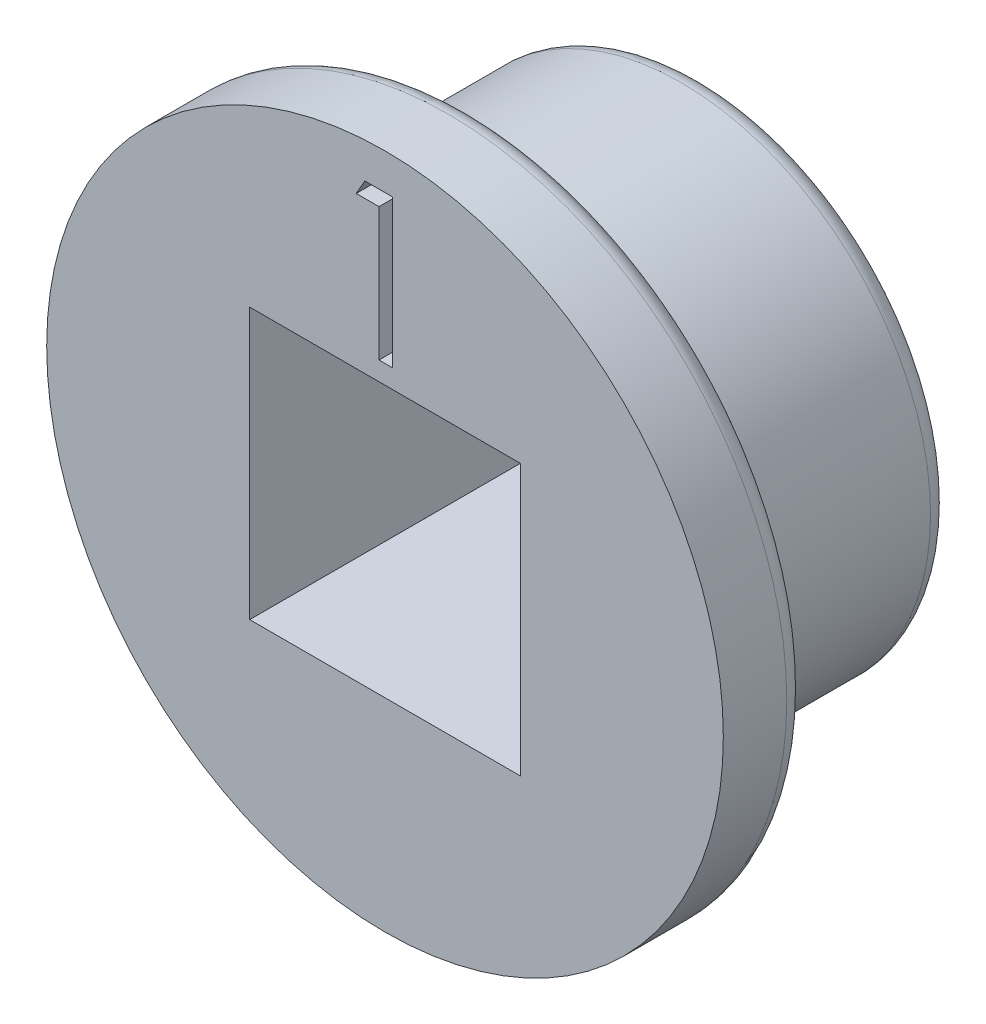
ISO-10303-21;
HEADER;
FILE_DESCRIPTION(('STEP AP214'),'2;1');
FILE_NAME('part.step','',(''),(''),'','','');
FILE_SCHEMA(('AUTOMOTIVE_DESIGN { 1 0 10303 214 1 1 1 1 }'));
ENDSEC;
DATA;
#1=APPLICATION_CONTEXT('core data for automotive mechanical design processes');
#2=APPLICATION_PROTOCOL_DEFINITION('international standard','automotive_design',2000,#1);
#3=PRODUCT_CONTEXT('',#1,'mechanical');
#4=PRODUCT('Part','Part','',(#3));
#5=PRODUCT_RELATED_PRODUCT_CATEGORY('part','',(#4));
#6=PRODUCT_DEFINITION_FORMATION('','',#4);
#7=PRODUCT_DEFINITION_CONTEXT('part definition',#1,'design');
#8=PRODUCT_DEFINITION('design','',#6,#7);
#9=PRODUCT_DEFINITION_SHAPE('','',#8);
#10=(LENGTH_UNIT() NAMED_UNIT(*) SI_UNIT(.MILLI.,.METRE.));
#11=(NAMED_UNIT(*) PLANE_ANGLE_UNIT() SI_UNIT($,.RADIAN.));
#12=(NAMED_UNIT(*) SI_UNIT($,.STERADIAN.) SOLID_ANGLE_UNIT());
#13=UNCERTAINTY_MEASURE_WITH_UNIT(LENGTH_MEASURE(1.E-05),#10,'distance_accuracy_value','');
#14=(GEOMETRIC_REPRESENTATION_CONTEXT(3) GLOBAL_UNCERTAINTY_ASSIGNED_CONTEXT((#13)) GLOBAL_UNIT_ASSIGNED_CONTEXT((#10,
#11,#12)) REPRESENTATION_CONTEXT('',''));
#15=CARTESIAN_POINT('',(0.,0.,0.));
#16=DIRECTION('',(0.,0.,1.));
#17=DIRECTION('',(1.,0.,0.));
#18=AXIS2_PLACEMENT_3D('',#15,#16,#17);
#19=CARTESIAN_POINT('',(0.,0.,2.));
#20=DIRECTION('',(0.,0.,1.));
#21=DIRECTION('',(1.,0.,0.));
#22=AXIS2_PLACEMENT_3D('',#19,#20,#21);
#23=PLANE('',#22);
#24=CARTESIAN_POINT('',(0.,0.,2.));
#25=DIRECTION('',(0.,0.,1.));
#26=DIRECTION('',(1.,0.,0.));
#27=AXIS2_PLACEMENT_3D('',#24,#25,#26);
#28=CIRCLE('',#27,8.);
#29=CARTESIAN_POINT('',(8.,0.,2.));
#30=VERTEX_POINT('',#29);
#31=EDGE_CURVE('E144',#30,#30,#28,.T.);
#32=ORIENTED_EDGE('',*,*,#31,.T.);
#33=EDGE_LOOP('',(#32));
#34=FACE_BOUND('',#33,.T.);
#35=DIRECTION('',(1.,0.,0.));
#36=VECTOR('',#35,1.);
#37=CARTESIAN_POINT('',(0.,3.2,2.));
#38=LINE('',#37,#36);
#39=CARTESIAN_POINT('',(-3.2,3.2,2.));
#40=VERTEX_POINT('',#39);
#41=CARTESIAN_POINT('',(3.2,3.2,2.));
#42=VERTEX_POINT('',#41);
#43=EDGE_CURVE('E150',#40,#42,#38,.T.);
#44=ORIENTED_EDGE('',*,*,#43,.T.);
#45=DIRECTION('',(0.,-1.,0.));
#46=VECTOR('',#45,1.);
#47=CARTESIAN_POINT('',(3.2,0.,2.));
#48=LINE('',#47,#46);
#49=CARTESIAN_POINT('',(3.2,-3.2,2.));
#50=VERTEX_POINT('',#49);
#51=EDGE_CURVE('E159',#42,#50,#48,.T.);
#52=ORIENTED_EDGE('',*,*,#51,.T.);
#53=DIRECTION('',(1.,0.,0.));
#54=VECTOR('',#53,1.);
#55=CARTESIAN_POINT('',(0.,-3.2,2.));
#56=LINE('',#55,#54);
#57=CARTESIAN_POINT('',(-3.2,-3.2,2.));
#58=VERTEX_POINT('',#57);
#59=EDGE_CURVE('E163',#58,#50,#56,.T.);
#60=ORIENTED_EDGE('',*,*,#59,.F.);
#61=DIRECTION('',(0.,-1.,0.));
#62=VECTOR('',#61,1.);
#63=CARTESIAN_POINT('',(-3.2,0.,2.));
#64=LINE('',#63,#62);
#65=EDGE_CURVE('E167',#40,#58,#64,.T.);
#66=ORIENTED_EDGE('',*,*,#65,.F.);
#67=EDGE_LOOP('',(#44,#52,#60,#66));
#68=FACE_BOUND('',#67,.T.);
#69=DIRECTION('',(-1.,0.,0.));
#70=VECTOR('',#69,1.);
#71=CARTESIAN_POINT('',(-0.142771573219212,6.78588612587348,2.));
#72=LINE('',#71,#70);
#73=CARTESIAN_POINT('',(-0.142771573219212,6.78588612587348,2.));
#74=VERTEX_POINT('',#73);
#75=CARTESIAN_POINT('',(-0.68123311168075,6.78588612587348,2.));
#76=VERTEX_POINT('',#75);
#77=EDGE_CURVE('E138',#74,#76,#72,.T.);
#78=ORIENTED_EDGE('',*,*,#77,.T.);
#79=DIRECTION('',(0.496686511837685,0.867930013859708,0.));
#80=VECTOR('',#79,1.);
#81=CARTESIAN_POINT('',(-0.68123311168075,6.78588612587348,2.));
#82=LINE('',#81,#80);
#83=CARTESIAN_POINT('',(-0.475804425783314,7.14486048484784,2.));
#84=VERTEX_POINT('',#83);
#85=EDGE_CURVE('E57',#76,#84,#82,.T.);
#86=ORIENTED_EDGE('',*,*,#85,.T.);
#87=DIRECTION('',(1.,0.,0.));
#88=VECTOR('',#87,1.);
#89=CARTESIAN_POINT('',(-0.475804425783314,7.14486048484784,2.));
#90=LINE('',#89,#88);
#91=CARTESIAN_POINT('',(0.171330990883352,7.14486048484784,2.));
#92=VERTEX_POINT('',#91);
#93=EDGE_CURVE('E142',#84,#92,#90,.T.);
#94=ORIENTED_EDGE('',*,*,#93,.T.);
#95=DIRECTION('',(0.,-1.,0.));
#96=VECTOR('',#95,1.);
#97=CARTESIAN_POINT('',(0.171330990883352,7.14486048484784,2.));
#98=LINE('',#97,#96);
#99=CARTESIAN_POINT('',(0.171330990883352,3.64486048484784,2.));
#100=VERTEX_POINT('',#99);
#101=EDGE_CURVE('E301',#92,#100,#98,.T.);
#102=ORIENTED_EDGE('',*,*,#101,.T.);
#103=DIRECTION('',(-1.,0.,0.));
#104=VECTOR('',#103,1.);
#105=CARTESIAN_POINT('',(0.171330990883352,3.64486048484784,2.));
#106=LINE('',#105,#104);
#107=CARTESIAN_POINT('',(-0.142771573219212,3.64486048484784,2.));
#108=VERTEX_POINT('',#107);
#109=EDGE_CURVE('E282',#100,#108,#106,.T.);
#110=ORIENTED_EDGE('',*,*,#109,.T.);
#111=DIRECTION('',(0.,1.,0.));
#112=VECTOR('',#111,1.);
#113=CARTESIAN_POINT('',(-0.142771573219212,3.64486048484784,2.));
#114=LINE('',#113,#112);
#115=EDGE_CURVE('E276',#108,#74,#114,.T.);
#116=ORIENTED_EDGE('',*,*,#115,.T.);
#117=EDGE_LOOP('',(#78,#86,#94,#102,#110,#116));
#118=FACE_BOUND('',#117,.T.);
#119=ADVANCED_FACE('F41',(#34,#68,#118),#23,.T.);
#120=CARTESIAN_POINT('',(0.,3.2,-5.5));
#121=DIRECTION('',(0.,-1.,0.));
#122=DIRECTION('',(0.,0.,-1.));
#123=AXIS2_PLACEMENT_3D('',#120,#121,#122);
#124=PLANE('',#123);
#125=DIRECTION('',(0.,0.,1.));
#126=VECTOR('',#125,1.);
#127=CARTESIAN_POINT('',(3.2,3.2,-5.5));
#128=LINE('',#127,#126);
#129=CARTESIAN_POINT('',(3.2,3.2,-5.5));
#130=VERTEX_POINT('',#129);
#131=EDGE_CURVE('E185',#130,#42,#128,.T.);
#132=ORIENTED_EDGE('',*,*,#131,.T.);
#133=ORIENTED_EDGE('',*,*,#43,.F.);
#134=DIRECTION('',(0.,0.,1.));
#135=VECTOR('',#134,1.);
#136=CARTESIAN_POINT('',(-3.2,3.2,-5.5));
#137=LINE('',#136,#135);
#138=CARTESIAN_POINT('',(-3.2,3.2,-5.5));
#139=VERTEX_POINT('',#138);
#140=EDGE_CURVE('E65',#139,#40,#137,.T.);
#141=ORIENTED_EDGE('',*,*,#140,.F.);
#142=DIRECTION('',(1.,0.,0.));
#143=VECTOR('',#142,1.);
#144=CARTESIAN_POINT('',(0.,3.2,-5.5));
#145=LINE('',#144,#143);
#146=EDGE_CURVE('E172',#139,#130,#145,.T.);
#147=ORIENTED_EDGE('',*,*,#146,.T.);
#148=EDGE_LOOP('',(#132,#133,#141,#147));
#149=FACE_BOUND('',#148,.T.);
#150=ADVANCED_FACE('F225',(#149),#124,.T.);
#151=CARTESIAN_POINT('',(-3.2,0.,-5.5));
#152=DIRECTION('',(-1.,0.,0.));
#153=DIRECTION('',(0.,0.,1.));
#154=AXIS2_PLACEMENT_3D('',#151,#152,#153);
#155=PLANE('',#154);
#156=ORIENTED_EDGE('',*,*,#140,.T.);
#157=ORIENTED_EDGE('',*,*,#65,.T.);
#158=DIRECTION('',(0.,0.,1.));
#159=VECTOR('',#158,1.);
#160=CARTESIAN_POINT('',(-3.2,-3.2,-5.5));
#161=LINE('',#160,#159);
#162=CARTESIAN_POINT('',(-3.2,-3.2,-5.5));
#163=VERTEX_POINT('',#162);
#164=EDGE_CURVE('E192',#163,#58,#161,.T.);
#165=ORIENTED_EDGE('',*,*,#164,.F.);
#166=DIRECTION('',(0.,-1.,0.));
#167=VECTOR('',#166,1.);
#168=CARTESIAN_POINT('',(-3.2,0.,-5.5));
#169=LINE('',#168,#167);
#170=EDGE_CURVE('E182',#139,#163,#169,.T.);
#171=ORIENTED_EDGE('',*,*,#170,.F.);
#172=EDGE_LOOP('',(#156,#157,#165,#171));
#173=FACE_BOUND('',#172,.T.);
#174=ADVANCED_FACE('F231',(#173),#155,.F.);
#175=CARTESIAN_POINT('',(0.,-3.2,-5.5));
#176=DIRECTION('',(0.,-1.,0.));
#177=DIRECTION('',(0.,0.,-1.));
#178=AXIS2_PLACEMENT_3D('',#175,#176,#177);
#179=PLANE('',#178);
#180=ORIENTED_EDGE('',*,*,#164,.T.);
#181=ORIENTED_EDGE('',*,*,#59,.T.);
#182=DIRECTION('',(0.,0.,1.));
#183=VECTOR('',#182,1.);
#184=CARTESIAN_POINT('',(3.2,-3.2,-5.5));
#185=LINE('',#184,#183);
#186=CARTESIAN_POINT('',(3.2,-3.2,-5.5));
#187=VERTEX_POINT('',#186);
#188=EDGE_CURVE('E195',#187,#50,#185,.T.);
#189=ORIENTED_EDGE('',*,*,#188,.F.);
#190=DIRECTION('',(1.,0.,0.));
#191=VECTOR('',#190,1.);
#192=CARTESIAN_POINT('',(0.,-3.2,-5.5));
#193=LINE('',#192,#191);
#194=EDGE_CURVE('E179',#163,#187,#193,.T.);
#195=ORIENTED_EDGE('',*,*,#194,.F.);
#196=EDGE_LOOP('',(#180,#181,#189,#195));
#197=FACE_BOUND('',#196,.T.);
#198=ADVANCED_FACE('F252',(#197),#179,.F.);
#199=CARTESIAN_POINT('',(3.2,0.,-5.5));
#200=DIRECTION('',(-1.,0.,0.));
#201=DIRECTION('',(0.,0.,1.));
#202=AXIS2_PLACEMENT_3D('',#199,#200,#201);
#203=PLANE('',#202);
#204=ORIENTED_EDGE('',*,*,#188,.T.);
#205=ORIENTED_EDGE('',*,*,#51,.F.);
#206=ORIENTED_EDGE('',*,*,#131,.F.);
#207=DIRECTION('',(0.,-1.,0.));
#208=VECTOR('',#207,1.);
#209=CARTESIAN_POINT('',(3.2,0.,-5.5));
#210=LINE('',#209,#208);
#211=EDGE_CURVE('E175',#130,#187,#210,.T.);
#212=ORIENTED_EDGE('',*,*,#211,.T.);
#213=EDGE_LOOP('',(#204,#205,#206,#212));
#214=FACE_BOUND('',#213,.T.);
#215=ADVANCED_FACE('F249',(#214),#203,.T.);
#216=CARTESIAN_POINT('',(0.,0.,-5.5));
#217=DIRECTION('',(0.,0.,1.));
#218=DIRECTION('',(1.,0.,0.));
#219=AXIS2_PLACEMENT_3D('',#216,#217,#218);
#220=CYLINDRICAL_SURFACE('',#219,5.9);
#221=CARTESIAN_POINT('',(0.,0.,-5.));
#222=DIRECTION('',(0.,0.,1.));
#223=DIRECTION('',(1.,0.,0.));
#224=AXIS2_PLACEMENT_3D('',#221,#222,#223);
#225=CIRCLE('',#224,5.9);
#226=CARTESIAN_POINT('',(5.9,0.,-5.));
#227=VERTEX_POINT('',#226);
#228=EDGE_CURVE('E50',#227,#227,#225,.T.);
#229=ORIENTED_EDGE('',*,*,#228,.T.);
#230=EDGE_LOOP('',(#229));
#231=FACE_BOUND('',#230,.T.);
#232=CARTESIAN_POINT('',(0.,0.,0.));
#233=DIRECTION('',(0.,0.,1.));
#234=DIRECTION('',(1.,0.,0.));
#235=AXIS2_PLACEMENT_3D('',#232,#233,#234);
#236=CIRCLE('',#235,5.9);
#237=CARTESIAN_POINT('',(5.9,0.,0.));
#238=VERTEX_POINT('',#237);
#239=EDGE_CURVE('E171',#238,#238,#236,.T.);
#240=ORIENTED_EDGE('',*,*,#239,.F.);
#241=EDGE_LOOP('',(#240));
#242=FACE_BOUND('',#241,.T.);
#243=ADVANCED_FACE('F210',(#231,#242),#220,.T.);
#244=CARTESIAN_POINT('',(0.,0.,-5.5));
#245=DIRECTION('',(0.,0.,1.));
#246=DIRECTION('',(1.,0.,0.));
#247=AXIS2_PLACEMENT_3D('',#244,#245,#246);
#248=PLANE('',#247);
#249=CARTESIAN_POINT('',(0.,0.,-5.5));
#250=DIRECTION('',(0.,0.,1.));
#251=DIRECTION('',(1.,0.,0.));
#252=AXIS2_PLACEMENT_3D('',#249,#250,#251);
#253=CIRCLE('',#252,5.4);
#254=CARTESIAN_POINT('',(5.4,0.,-5.5));
#255=VERTEX_POINT('',#254);
#256=EDGE_CURVE('E11',#255,#255,#253,.F.);
#257=ORIENTED_EDGE('',*,*,#256,.T.);
#258=EDGE_LOOP('',(#257));
#259=FACE_BOUND('',#258,.T.);
#260=ORIENTED_EDGE('',*,*,#146,.F.);
#261=ORIENTED_EDGE('',*,*,#170,.T.);
#262=ORIENTED_EDGE('',*,*,#194,.T.);
#263=ORIENTED_EDGE('',*,*,#211,.F.);
#264=EDGE_LOOP('',(#260,#261,#262,#263));
#265=FACE_BOUND('',#264,.T.);
#266=ADVANCED_FACE('F242',(#259,#265),#248,.F.);
#267=CARTESIAN_POINT('',(0.,0.,2.));
#268=DIRECTION('',(0.,0.,-1.));
#269=DIRECTION('',(-1.,0.,0.));
#270=AXIS2_PLACEMENT_3D('',#267,#268,#269);
#271=CYLINDRICAL_SURFACE('',#270,8.);
#272=CARTESIAN_POINT('',(0.,0.,0.5));
#273=DIRECTION('',(0.,0.,1.));
#274=DIRECTION('',(1.,0.,0.));
#275=AXIS2_PLACEMENT_3D('',#272,#273,#274);
#276=CIRCLE('',#275,8.);
#277=CARTESIAN_POINT('',(8.,0.,0.5));
#278=VERTEX_POINT('',#277);
#279=EDGE_CURVE('E191',#278,#278,#276,.T.);
#280=ORIENTED_EDGE('',*,*,#279,.T.);
#281=EDGE_LOOP('',(#280));
#282=FACE_BOUND('',#281,.T.);
#283=ORIENTED_EDGE('',*,*,#31,.F.);
#284=EDGE_LOOP('',(#283));
#285=FACE_BOUND('',#284,.T.);
#286=ADVANCED_FACE('F238',(#282,#285),#271,.T.);
#287=CARTESIAN_POINT('',(0.,0.,0.));
#288=DIRECTION('',(0.,0.,1.));
#289=DIRECTION('',(1.,0.,0.));
#290=AXIS2_PLACEMENT_3D('',#287,#288,#289);
#291=PLANE('',#290);
#292=CARTESIAN_POINT('',(0.,0.,0.));
#293=DIRECTION('',(0.,0.,1.));
#294=DIRECTION('',(1.,0.,0.));
#295=AXIS2_PLACEMENT_3D('',#292,#293,#294);
#296=CIRCLE('',#295,7.5);
#297=CARTESIAN_POINT('',(7.5,0.,0.));
#298=VERTEX_POINT('',#297);
#299=EDGE_CURVE('E203',#298,#298,#296,.F.);
#300=ORIENTED_EDGE('',*,*,#299,.T.);
#301=EDGE_LOOP('',(#300));
#302=FACE_BOUND('',#301,.T.);
#303=ORIENTED_EDGE('',*,*,#239,.T.);
#304=EDGE_LOOP('',(#303));
#305=FACE_BOUND('',#304,.T.);
#306=ADVANCED_FACE('F221',(#302,#305),#291,.F.);
#307=CARTESIAN_POINT('',(0.,0.,0.5));
#308=DIRECTION('',(0.,0.,1.));
#309=DIRECTION('',(1.,0.,0.));
#310=AXIS2_PLACEMENT_3D('',#307,#308,#309);
#311=TOROIDAL_SURFACE('',#310,7.5,0.5);
#312=ORIENTED_EDGE('',*,*,#299,.F.);
#313=EDGE_LOOP('',(#312));
#314=FACE_BOUND('',#313,.T.);
#315=ORIENTED_EDGE('',*,*,#279,.F.);
#316=EDGE_LOOP('',(#315));
#317=FACE_BOUND('',#316,.T.);
#318=ADVANCED_FACE('F214',(#314,#317),#311,.T.);
#319=CARTESIAN_POINT('',(0.,0.,-5.));
#320=DIRECTION('',(0.,0.,1.));
#321=DIRECTION('',(1.,0.,0.));
#322=AXIS2_PLACEMENT_3D('',#319,#320,#321);
#323=TOROIDAL_SURFACE('',#322,5.4,0.5);
#324=ORIENTED_EDGE('',*,*,#256,.F.);
#325=EDGE_LOOP('',(#324));
#326=FACE_BOUND('',#325,.T.);
#327=ORIENTED_EDGE('',*,*,#228,.F.);
#328=EDGE_LOOP('',(#327));
#329=FACE_BOUND('',#328,.T.);
#330=ADVANCED_FACE('F43',(#326,#329),#323,.T.);
#331=CARTESIAN_POINT('',(-0.68123311168075,6.78588612587348,1.5));
#332=DIRECTION('',(0.867930013859708,-0.496686511837685,0.));
#333=DIRECTION('',(0.496686511837685,0.867930013859708,0.));
#334=AXIS2_PLACEMENT_3D('',#331,#332,#333);
#335=PLANE('',#334);
#336=ORIENTED_EDGE('',*,*,#85,.F.);
#337=DIRECTION('',(0.,0.,1.));
#338=VECTOR('',#337,1.);
#339=CARTESIAN_POINT('',(-0.68123311168075,6.78588612587348,1.5));
#340=LINE('',#339,#338);
#341=CARTESIAN_POINT('',(-0.68123311168075,6.78588612587348,1.5));
#342=VERTEX_POINT('',#341);
#343=EDGE_CURVE('E136',#342,#76,#340,.T.);
#344=ORIENTED_EDGE('',*,*,#343,.F.);
#345=DIRECTION('',(0.496686511837685,0.867930013859708,0.));
#346=VECTOR('',#345,1.);
#347=CARTESIAN_POINT('',(-0.68123311168075,6.78588612587348,1.5));
#348=LINE('',#347,#346);
#349=CARTESIAN_POINT('',(-0.475804425783314,7.14486048484784,1.5));
#350=VERTEX_POINT('',#349);
#351=EDGE_CURVE('E126',#342,#350,#348,.T.);
#352=ORIENTED_EDGE('',*,*,#351,.T.);
#353=DIRECTION('',(0.,0.,1.));
#354=VECTOR('',#353,1.);
#355=CARTESIAN_POINT('',(-0.475804425783314,7.14486048484784,1.5));
#356=LINE('',#355,#354);
#357=EDGE_CURVE('E135',#350,#84,#356,.T.);
#358=ORIENTED_EDGE('',*,*,#357,.T.);
#359=EDGE_LOOP('',(#336,#344,#352,#358));
#360=FACE_BOUND('',#359,.T.);
#361=ADVANCED_FACE('F134',(#360),#335,.T.);
#362=CARTESIAN_POINT('',(-0.475804425783314,7.14486048484784,1.5));
#363=DIRECTION('',(0.,-1.,0.));
#364=DIRECTION('',(0.,0.,-1.));
#365=AXIS2_PLACEMENT_3D('',#362,#363,#364);
#366=PLANE('',#365);
#367=ORIENTED_EDGE('',*,*,#93,.F.);
#368=ORIENTED_EDGE('',*,*,#357,.F.);
#369=DIRECTION('',(1.,0.,0.));
#370=VECTOR('',#369,1.);
#371=CARTESIAN_POINT('',(-0.475804425783314,7.14486048484784,1.5));
#372=LINE('',#371,#370);
#373=CARTESIAN_POINT('',(0.171330990883352,7.14486048484784,1.5));
#374=VERTEX_POINT('',#373);
#375=EDGE_CURVE('E122',#350,#374,#372,.T.);
#376=ORIENTED_EDGE('',*,*,#375,.T.);
#377=DIRECTION('',(0.,0.,1.));
#378=VECTOR('',#377,1.);
#379=CARTESIAN_POINT('',(0.171330990883352,7.14486048484784,1.5));
#380=LINE('',#379,#378);
#381=EDGE_CURVE('E145',#374,#92,#380,.T.);
#382=ORIENTED_EDGE('',*,*,#381,.T.);
#383=EDGE_LOOP('',(#367,#368,#376,#382));
#384=FACE_BOUND('',#383,.T.);
#385=ADVANCED_FACE('F140',(#384),#366,.T.);
#386=CARTESIAN_POINT('',(0.171330990883352,7.14486048484784,1.5));
#387=DIRECTION('',(-1.,0.,0.));
#388=DIRECTION('',(0.,0.,1.));
#389=AXIS2_PLACEMENT_3D('',#386,#387,#388);
#390=PLANE('',#389);
#391=ORIENTED_EDGE('',*,*,#101,.F.);
#392=ORIENTED_EDGE('',*,*,#381,.F.);
#393=DIRECTION('',(0.,-1.,0.));
#394=VECTOR('',#393,1.);
#395=CARTESIAN_POINT('',(0.171330990883352,7.14486048484784,1.5));
#396=LINE('',#395,#394);
#397=CARTESIAN_POINT('',(0.171330990883352,3.64486048484784,1.5));
#398=VERTEX_POINT('',#397);
#399=EDGE_CURVE('E128',#374,#398,#396,.T.);
#400=ORIENTED_EDGE('',*,*,#399,.T.);
#401=DIRECTION('',(0.,0.,1.));
#402=VECTOR('',#401,1.);
#403=CARTESIAN_POINT('',(0.171330990883352,3.64486048484784,1.5));
#404=LINE('',#403,#402);
#405=EDGE_CURVE('E152',#398,#100,#404,.T.);
#406=ORIENTED_EDGE('',*,*,#405,.T.);
#407=EDGE_LOOP('',(#391,#392,#400,#406));
#408=FACE_BOUND('',#407,.T.);
#409=ADVANCED_FACE('F299',(#408),#390,.T.);
#410=CARTESIAN_POINT('',(0.171330990883352,3.64486048484784,1.5));
#411=DIRECTION('',(0.,1.,0.));
#412=DIRECTION('',(0.,0.,1.));
#413=AXIS2_PLACEMENT_3D('',#410,#411,#412);
#414=PLANE('',#413);
#415=ORIENTED_EDGE('',*,*,#109,.F.);
#416=ORIENTED_EDGE('',*,*,#405,.F.);
#417=DIRECTION('',(-1.,0.,0.));
#418=VECTOR('',#417,1.);
#419=CARTESIAN_POINT('',(0.171330990883352,3.64486048484784,1.5));
#420=LINE('',#419,#418);
#421=CARTESIAN_POINT('',(-0.142771573219212,3.64486048484784,1.5));
#422=VERTEX_POINT('',#421);
#423=EDGE_CURVE('E318',#398,#422,#420,.T.);
#424=ORIENTED_EDGE('',*,*,#423,.T.);
#425=DIRECTION('',(0.,0.,1.));
#426=VECTOR('',#425,1.);
#427=CARTESIAN_POINT('',(-0.142771573219212,3.64486048484784,1.5));
#428=LINE('',#427,#426);
#429=EDGE_CURVE('E292',#422,#108,#428,.T.);
#430=ORIENTED_EDGE('',*,*,#429,.T.);
#431=EDGE_LOOP('',(#415,#416,#424,#430));
#432=FACE_BOUND('',#431,.T.);
#433=ADVANCED_FACE('F303',(#432),#414,.T.);
#434=CARTESIAN_POINT('',(-0.142771573219212,3.64486048484784,1.5));
#435=DIRECTION('',(1.,0.,0.));
#436=DIRECTION('',(0.,0.,-1.));
#437=AXIS2_PLACEMENT_3D('',#434,#435,#436);
#438=PLANE('',#437);
#439=ORIENTED_EDGE('',*,*,#115,.F.);
#440=ORIENTED_EDGE('',*,*,#429,.F.);
#441=DIRECTION('',(0.,1.,0.));
#442=VECTOR('',#441,1.);
#443=CARTESIAN_POINT('',(-0.142771573219212,3.64486048484784,1.5));
#444=LINE('',#443,#442);
#445=CARTESIAN_POINT('',(-0.142771573219212,6.78588612587348,1.5));
#446=VERTEX_POINT('',#445);
#447=EDGE_CURVE('E315',#422,#446,#444,.T.);
#448=ORIENTED_EDGE('',*,*,#447,.T.);
#449=DIRECTION('',(0.,0.,1.));
#450=VECTOR('',#449,1.);
#451=CARTESIAN_POINT('',(-0.142771573219212,6.78588612587348,1.5));
#452=LINE('',#451,#450);
#453=EDGE_CURVE('E288',#446,#74,#452,.T.);
#454=ORIENTED_EDGE('',*,*,#453,.T.);
#455=EDGE_LOOP('',(#439,#440,#448,#454));
#456=FACE_BOUND('',#455,.T.);
#457=ADVANCED_FACE('F324',(#456),#438,.T.);
#458=CARTESIAN_POINT('',(-0.142771573219212,6.78588612587348,1.5));
#459=DIRECTION('',(0.,1.,0.));
#460=DIRECTION('',(0.,0.,1.));
#461=AXIS2_PLACEMENT_3D('',#458,#459,#460);
#462=PLANE('',#461);
#463=ORIENTED_EDGE('',*,*,#77,.F.);
#464=ORIENTED_EDGE('',*,*,#453,.F.);
#465=DIRECTION('',(-1.,0.,0.));
#466=VECTOR('',#465,1.);
#467=CARTESIAN_POINT('',(-0.142771573219212,6.78588612587348,1.5));
#468=LINE('',#467,#466);
#469=EDGE_CURVE('E289',#446,#342,#468,.T.);
#470=ORIENTED_EDGE('',*,*,#469,.T.);
#471=ORIENTED_EDGE('',*,*,#343,.T.);
#472=EDGE_LOOP('',(#463,#464,#470,#471));
#473=FACE_BOUND('',#472,.T.);
#474=ADVANCED_FACE('F325',(#473),#462,.T.);
#475=CARTESIAN_POINT('',(0.,0.,1.5));
#476=DIRECTION('',(0.,0.,-1.));
#477=DIRECTION('',(-1.,0.,0.));
#478=AXIS2_PLACEMENT_3D('',#475,#476,#477);
#479=PLANE('',#478);
#480=ORIENTED_EDGE('',*,*,#351,.F.);
#481=ORIENTED_EDGE('',*,*,#469,.F.);
#482=ORIENTED_EDGE('',*,*,#447,.F.);
#483=ORIENTED_EDGE('',*,*,#423,.F.);
#484=ORIENTED_EDGE('',*,*,#399,.F.);
#485=ORIENTED_EDGE('',*,*,#375,.F.);
#486=EDGE_LOOP('',(#480,#481,#482,#483,#484,#485));
#487=FACE_BOUND('',#486,.T.);
#488=ADVANCED_FACE('F124',(#487),#479,.F.);
#489=CLOSED_SHELL('',(#119,#150,#174,#198,#215,#243,#266,#286,#306,#318,#330,#361,#385,#409,
#433,#457,#474,#488));
#490=MANIFOLD_SOLID_BREP('B2',#489);
#491=ADVANCED_BREP_SHAPE_REPRESENTATION('',(#18,#490),#14);
#492=SHAPE_DEFINITION_REPRESENTATION(#9,#491);
ENDSEC;
END-ISO-10303-21;
